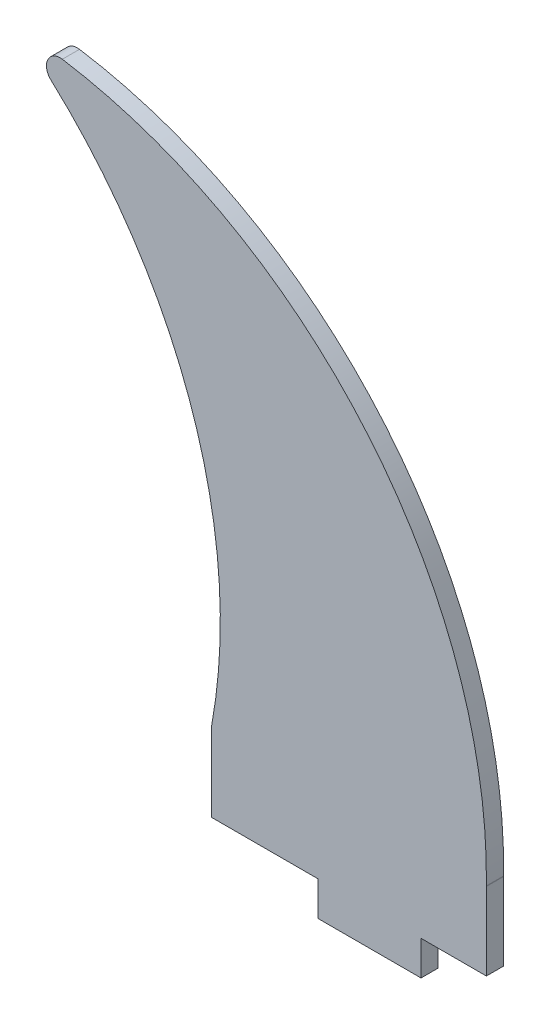
ISO-10303-21;
HEADER;
FILE_DESCRIPTION(('STEP AP214'),'2;1');
FILE_NAME('part.step','',(''),(''),'','','');
FILE_SCHEMA(('AUTOMOTIVE_DESIGN { 1 0 10303 214 1 1 1 1 }'));
ENDSEC;
DATA;
#1=APPLICATION_CONTEXT('core data for automotive mechanical design processes');
#2=APPLICATION_PROTOCOL_DEFINITION('international standard','automotive_design',2000,#1);
#3=PRODUCT_CONTEXT('',#1,'mechanical');
#4=PRODUCT('Part','Part','',(#3));
#5=PRODUCT_RELATED_PRODUCT_CATEGORY('part','',(#4));
#6=PRODUCT_DEFINITION_FORMATION('','',#4);
#7=PRODUCT_DEFINITION_CONTEXT('part definition',#1,'design');
#8=PRODUCT_DEFINITION('design','',#6,#7);
#9=PRODUCT_DEFINITION_SHAPE('','',#8);
#10=(LENGTH_UNIT() NAMED_UNIT(*) SI_UNIT(.MILLI.,.METRE.));
#11=(NAMED_UNIT(*) PLANE_ANGLE_UNIT() SI_UNIT($,.RADIAN.));
#12=(NAMED_UNIT(*) SI_UNIT($,.STERADIAN.) SOLID_ANGLE_UNIT());
#13=UNCERTAINTY_MEASURE_WITH_UNIT(LENGTH_MEASURE(1.E-05),#10,'distance_accuracy_value','');
#14=(GEOMETRIC_REPRESENTATION_CONTEXT(3) GLOBAL_UNCERTAINTY_ASSIGNED_CONTEXT((#13)) GLOBAL_UNIT_ASSIGNED_CONTEXT((#10,
#11,#12)) REPRESENTATION_CONTEXT('',''));
#15=CARTESIAN_POINT('',(0.,0.,0.));
#16=DIRECTION('',(0.,0.,1.));
#17=DIRECTION('',(1.,0.,0.));
#18=AXIS2_PLACEMENT_3D('',#15,#16,#17);
#19=CARTESIAN_POINT('',(-42.1158930006279,15.7352926467519,3.175));
#20=DIRECTION('',(0.,0.,-1.));
#21=DIRECTION('',(-1.,0.,0.));
#22=AXIS2_PLACEMENT_3D('',#19,#20,#21);
#23=CYLINDRICAL_SURFACE('',#22,92.948591990492);
#24=CARTESIAN_POINT('',(-42.1158930006279,15.7352926467519,0.));
#25=DIRECTION('',(0.,0.,1.));
#26=DIRECTION('',(1.,0.,0.));
#27=AXIS2_PLACEMENT_3D('',#24,#25,#26);
#28=CIRCLE('',#27,92.948591990492);
#29=CARTESIAN_POINT('',(-27.5289906449346,107.532150069435,0.));
#30=VERTEX_POINT('',#29);
#31=CARTESIAN_POINT('',(50.8234566403308,14.4245518903177,0.));
#32=VERTEX_POINT('',#31);
#33=EDGE_CURVE('E166',#30,#32,#28,.F.);
#34=ORIENTED_EDGE('',*,*,#33,.F.);
#35=DIRECTION('',(0.,0.,-1.));
#36=VECTOR('',#35,1.);
#37=CARTESIAN_POINT('',(-27.5289906449346,107.532150069435,3.175));
#38=LINE('',#37,#36);
#39=CARTESIAN_POINT('',(-27.5289906449346,107.532150069435,3.175));
#40=VERTEX_POINT('',#39);
#41=EDGE_CURVE('E43',#30,#40,#38,.F.);
#42=ORIENTED_EDGE('',*,*,#41,.T.);
#43=CARTESIAN_POINT('',(-42.1158930006279,15.7352926467519,3.175));
#44=DIRECTION('',(0.,0.,1.));
#45=DIRECTION('',(1.,0.,0.));
#46=AXIS2_PLACEMENT_3D('',#43,#44,#45);
#47=CIRCLE('',#46,92.948591990492);
#48=CARTESIAN_POINT('',(50.8234566403308,14.4245518903177,3.175));
#49=VERTEX_POINT('',#48);
#50=EDGE_CURVE('E152',#40,#49,#47,.F.);
#51=ORIENTED_EDGE('',*,*,#50,.T.);
#52=DIRECTION('',(0.,0.,-1.));
#53=VECTOR('',#52,1.);
#54=CARTESIAN_POINT('',(50.8234566403308,14.4245518903177,3.175));
#55=LINE('',#54,#53);
#56=EDGE_CURVE('E133',#49,#32,#55,.T.);
#57=ORIENTED_EDGE('',*,*,#56,.T.);
#58=EDGE_LOOP('',(#34,#42,#51,#57));
#59=FACE_BOUND('',#58,.T.);
#60=ADVANCED_FACE('F35',(#59),#23,.T.);
#61=CARTESIAN_POINT('',(-94.4551851220237,32.1733024197668,3.175));
#62=DIRECTION('',(0.,0.,-1.));
#63=DIRECTION('',(-1.,0.,0.));
#64=AXIS2_PLACEMENT_3D('',#61,#62,#63);
#65=CYLINDRICAL_SURFACE('',#64,96.1164142002075);
#66=CARTESIAN_POINT('',(-94.4551851220237,32.1733024197668,3.175));
#67=DIRECTION('',(0.,0.,1.));
#68=DIRECTION('',(1.,0.,0.));
#69=AXIS2_PLACEMENT_3D('',#66,#67,#68);
#70=CIRCLE('',#69,96.1164142002075);
#71=CARTESIAN_POINT('',(0.102948900171887,14.9360065487099,3.175));
#72=VERTEX_POINT('',#71);
#73=CARTESIAN_POINT('',(-29.6404195883238,103.148025015331,3.175));
#74=VERTEX_POINT('',#73);
#75=EDGE_CURVE('E149',#72,#74,#70,.T.);
#76=ORIENTED_EDGE('',*,*,#75,.T.);
#77=DIRECTION('',(0.,0.,-1.));
#78=VECTOR('',#77,1.);
#79=CARTESIAN_POINT('',(-29.6404195883238,103.148025015332,3.175));
#80=LINE('',#79,#78);
#81=CARTESIAN_POINT('',(-29.6404195883238,103.148025015331,0.));
#82=VERTEX_POINT('',#81);
#83=EDGE_CURVE('E211',#74,#82,#80,.T.);
#84=ORIENTED_EDGE('',*,*,#83,.T.);
#85=CARTESIAN_POINT('',(-94.4551851220237,32.1733024197668,0.));
#86=DIRECTION('',(0.,0.,1.));
#87=DIRECTION('',(1.,0.,0.));
#88=AXIS2_PLACEMENT_3D('',#85,#86,#87);
#89=CIRCLE('',#88,96.1164142002075);
#90=CARTESIAN_POINT('',(0.102948900171887,14.9360065487099,0.));
#91=VERTEX_POINT('',#90);
#92=EDGE_CURVE('E168',#91,#82,#89,.T.);
#93=ORIENTED_EDGE('',*,*,#92,.F.);
#94=DIRECTION('',(0.,0.,-1.));
#95=VECTOR('',#94,1.);
#96=CARTESIAN_POINT('',(0.102948900171887,14.9360065487099,3.175));
#97=LINE('',#96,#95);
#98=EDGE_CURVE('E203',#91,#72,#97,.F.);
#99=ORIENTED_EDGE('',*,*,#98,.T.);
#100=EDGE_LOOP('',(#76,#84,#93,#99));
#101=FACE_BOUND('',#100,.T.);
#102=ADVANCED_FACE('F217',(#101),#65,.F.);
#103=CARTESIAN_POINT('',(0.,0.,3.175));
#104=DIRECTION('',(-1.,0.,0.));
#105=DIRECTION('',(0.,0.,1.));
#106=AXIS2_PLACEMENT_3D('',#103,#104,#105);
#107=PLANE('',#106);
#108=DIRECTION('',(0.,1.,0.));
#109=VECTOR('',#108,1.);
#110=CARTESIAN_POINT('',(0.,0.,3.175));
#111=LINE('',#110,#109);
#112=CARTESIAN_POINT('',(0.,0.,3.175));
#113=VERTEX_POINT('',#112);
#114=CARTESIAN_POINT('',(0.,13.7972122054959,3.175));
#115=VERTEX_POINT('',#114);
#116=EDGE_CURVE('E127',#113,#115,#111,.T.);
#117=ORIENTED_EDGE('',*,*,#116,.T.);
#118=DIRECTION('',(0.,0.,-1.));
#119=VECTOR('',#118,1.);
#120=CARTESIAN_POINT('',(0.,13.7972122054959,3.175));
#121=LINE('',#120,#119);
#122=CARTESIAN_POINT('',(0.,13.7972122054959,0.));
#123=VERTEX_POINT('',#122);
#124=EDGE_CURVE('E199',#115,#123,#121,.T.);
#125=ORIENTED_EDGE('',*,*,#124,.T.);
#126=DIRECTION('',(0.,1.,0.));
#127=VECTOR('',#126,1.);
#128=CARTESIAN_POINT('',(0.,0.,0.));
#129=LINE('',#128,#127);
#130=CARTESIAN_POINT('',(0.,0.,0.));
#131=VERTEX_POINT('',#130);
#132=EDGE_CURVE('E130',#131,#123,#129,.T.);
#133=ORIENTED_EDGE('',*,*,#132,.F.);
#134=DIRECTION('',(0.,0.,-1.));
#135=VECTOR('',#134,1.);
#136=CARTESIAN_POINT('',(0.,0.,3.175));
#137=LINE('',#136,#135);
#138=EDGE_CURVE('E122',#113,#131,#137,.T.);
#139=ORIENTED_EDGE('',*,*,#138,.F.);
#140=EDGE_LOOP('',(#117,#125,#133,#139));
#141=FACE_BOUND('',#140,.T.);
#142=ADVANCED_FACE('F124',(#141),#107,.T.);
#143=CARTESIAN_POINT('',(0.,0.,3.175));
#144=DIRECTION('',(0.,1.,0.));
#145=DIRECTION('',(0.,0.,1.));
#146=AXIS2_PLACEMENT_3D('',#143,#144,#145);
#147=PLANE('',#146);
#148=DIRECTION('',(1.,0.,0.));
#149=VECTOR('',#148,1.);
#150=CARTESIAN_POINT('',(0.,0.,0.));
#151=LINE('',#150,#149);
#152=CARTESIAN_POINT('',(19.7016082065737,0.,0.));
#153=VERTEX_POINT('',#152);
#154=EDGE_CURVE('E171',#131,#153,#151,.T.);
#155=ORIENTED_EDGE('',*,*,#154,.T.);
#156=DIRECTION('',(0.,0.,-1.));
#157=VECTOR('',#156,1.);
#158=CARTESIAN_POINT('',(19.7016082065737,0.,3.175));
#159=LINE('',#158,#157);
#160=CARTESIAN_POINT('',(19.7016082065737,0.,3.175));
#161=VERTEX_POINT('',#160);
#162=EDGE_CURVE('E134',#161,#153,#159,.T.);
#163=ORIENTED_EDGE('',*,*,#162,.F.);
#164=DIRECTION('',(1.,0.,0.));
#165=VECTOR('',#164,1.);
#166=CARTESIAN_POINT('',(0.,0.,3.175));
#167=LINE('',#166,#165);
#168=EDGE_CURVE('E137',#113,#161,#167,.T.);
#169=ORIENTED_EDGE('',*,*,#168,.F.);
#170=ORIENTED_EDGE('',*,*,#138,.T.);
#171=EDGE_LOOP('',(#155,#163,#169,#170));
#172=FACE_BOUND('',#171,.T.);
#173=ADVANCED_FACE('F138',(#172),#147,.F.);
#174=CARTESIAN_POINT('',(19.7016082065737,0.,3.175));
#175=DIRECTION('',(1.,0.,0.));
#176=DIRECTION('',(0.,0.,-1.));
#177=AXIS2_PLACEMENT_3D('',#174,#175,#176);
#178=PLANE('',#177);
#179=DIRECTION('',(0.,-1.,0.));
#180=VECTOR('',#179,1.);
#181=CARTESIAN_POINT('',(19.7016082065737,0.,0.));
#182=LINE('',#181,#180);
#183=CARTESIAN_POINT('',(19.7016082065737,-6.35,0.));
#184=VERTEX_POINT('',#183);
#185=EDGE_CURVE('E173',#153,#184,#182,.T.);
#186=ORIENTED_EDGE('',*,*,#185,.T.);
#187=DIRECTION('',(0.,0.,-1.));
#188=VECTOR('',#187,1.);
#189=CARTESIAN_POINT('',(19.7016082065737,-6.35,3.175));
#190=LINE('',#189,#188);
#191=CARTESIAN_POINT('',(19.7016082065737,-6.35,3.175));
#192=VERTEX_POINT('',#191);
#193=EDGE_CURVE('E191',#192,#184,#190,.T.);
#194=ORIENTED_EDGE('',*,*,#193,.F.);
#195=DIRECTION('',(0.,-1.,0.));
#196=VECTOR('',#195,1.);
#197=CARTESIAN_POINT('',(19.7016082065737,0.,3.175));
#198=LINE('',#197,#196);
#199=EDGE_CURVE('E142',#161,#192,#198,.T.);
#200=ORIENTED_EDGE('',*,*,#199,.F.);
#201=ORIENTED_EDGE('',*,*,#162,.T.);
#202=EDGE_LOOP('',(#186,#194,#200,#201));
#203=FACE_BOUND('',#202,.T.);
#204=ADVANCED_FACE('F267',(#203),#178,.F.);
#205=CARTESIAN_POINT('',(0.,-6.35,3.175));
#206=DIRECTION('',(0.,1.,0.));
#207=DIRECTION('',(0.,0.,1.));
#208=AXIS2_PLACEMENT_3D('',#205,#206,#207);
#209=PLANE('',#208);
#210=DIRECTION('',(1.,0.,0.));
#211=VECTOR('',#210,1.);
#212=CARTESIAN_POINT('',(0.,-6.35,0.));
#213=LINE('',#212,#211);
#214=CARTESIAN_POINT('',(38.7516082065737,-6.35,0.));
#215=VERTEX_POINT('',#214);
#216=EDGE_CURVE('E176',#184,#215,#213,.T.);
#217=ORIENTED_EDGE('',*,*,#216,.T.);
#218=DIRECTION('',(0.,0.,-1.));
#219=VECTOR('',#218,1.);
#220=CARTESIAN_POINT('',(38.7516082065737,-6.35,3.175));
#221=LINE('',#220,#219);
#222=CARTESIAN_POINT('',(38.7516082065737,-6.35,3.175));
#223=VERTEX_POINT('',#222);
#224=EDGE_CURVE('E189',#223,#215,#221,.T.);
#225=ORIENTED_EDGE('',*,*,#224,.F.);
#226=DIRECTION('',(1.,0.,0.));
#227=VECTOR('',#226,1.);
#228=CARTESIAN_POINT('',(0.,-6.35,3.175));
#229=LINE('',#228,#227);
#230=EDGE_CURVE('E157',#192,#223,#229,.T.);
#231=ORIENTED_EDGE('',*,*,#230,.F.);
#232=ORIENTED_EDGE('',*,*,#193,.T.);
#233=EDGE_LOOP('',(#217,#225,#231,#232));
#234=FACE_BOUND('',#233,.T.);
#235=ADVANCED_FACE('F263',(#234),#209,.F.);
#236=CARTESIAN_POINT('',(38.7516082065737,0.,3.175));
#237=DIRECTION('',(1.,0.,0.));
#238=DIRECTION('',(0.,0.,-1.));
#239=AXIS2_PLACEMENT_3D('',#236,#237,#238);
#240=PLANE('',#239);
#241=DIRECTION('',(0.,-1.,0.));
#242=VECTOR('',#241,1.);
#243=CARTESIAN_POINT('',(38.7516082065737,0.,0.));
#244=LINE('',#243,#242);
#245=CARTESIAN_POINT('',(38.7516082065737,0.,0.));
#246=VERTEX_POINT('',#245);
#247=EDGE_CURVE('E179',#246,#215,#244,.T.);
#248=ORIENTED_EDGE('',*,*,#247,.F.);
#249=DIRECTION('',(0.,0.,-1.));
#250=VECTOR('',#249,1.);
#251=CARTESIAN_POINT('',(38.7516082065737,0.,3.175));
#252=LINE('',#251,#250);
#253=CARTESIAN_POINT('',(38.7516082065737,0.,3.175));
#254=VERTEX_POINT('',#253);
#255=EDGE_CURVE('E187',#254,#246,#252,.T.);
#256=ORIENTED_EDGE('',*,*,#255,.F.);
#257=DIRECTION('',(0.,-1.,0.));
#258=VECTOR('',#257,1.);
#259=CARTESIAN_POINT('',(38.7516082065737,0.,3.175));
#260=LINE('',#259,#258);
#261=EDGE_CURVE('E159',#254,#223,#260,.T.);
#262=ORIENTED_EDGE('',*,*,#261,.T.);
#263=ORIENTED_EDGE('',*,*,#224,.T.);
#264=EDGE_LOOP('',(#248,#256,#262,#263));
#265=FACE_BOUND('',#264,.T.);
#266=ADVANCED_FACE('F259',(#265),#240,.T.);
#267=CARTESIAN_POINT('',(50.8228252276512,0.,0.));
#268=VERTEX_POINT('',#267);
#269=EDGE_CURVE('E174',#246,#268,#151,.T.);
#270=ORIENTED_EDGE('',*,*,#269,.T.);
#271=DIRECTION('',(0.,0.,-1.));
#272=VECTOR('',#271,1.);
#273=CARTESIAN_POINT('',(50.8228252276512,0.,3.175));
#274=LINE('',#273,#272);
#275=CARTESIAN_POINT('',(50.8228252276512,0.,3.175));
#276=VERTEX_POINT('',#275);
#277=EDGE_CURVE('E165',#276,#268,#274,.T.);
#278=ORIENTED_EDGE('',*,*,#277,.F.);
#279=EDGE_CURVE('E144',#254,#276,#167,.T.);
#280=ORIENTED_EDGE('',*,*,#279,.F.);
#281=ORIENTED_EDGE('',*,*,#255,.T.);
#282=EDGE_LOOP('',(#270,#278,#280,#281));
#283=FACE_BOUND('',#282,.T.);
#284=ADVANCED_FACE('F276',(#283),#147,.F.);
#285=CARTESIAN_POINT('',(50.8228252276512,0.,3.175));
#286=DIRECTION('',(-1.,0.,0.));
#287=DIRECTION('',(0.,0.,1.));
#288=AXIS2_PLACEMENT_3D('',#285,#286,#287);
#289=PLANE('',#288);
#290=DIRECTION('',(0.,1.,0.));
#291=VECTOR('',#290,1.);
#292=CARTESIAN_POINT('',(50.8228252276512,0.,0.));
#293=LINE('',#292,#291);
#294=CARTESIAN_POINT('',(50.8228252276512,14.3350055763271,0.));
#295=VERTEX_POINT('',#294);
#296=EDGE_CURVE('E182',#268,#295,#293,.T.);
#297=ORIENTED_EDGE('',*,*,#296,.T.);
#298=DIRECTION('',(0.,0.,-1.));
#299=VECTOR('',#298,1.);
#300=CARTESIAN_POINT('',(50.8228252276512,14.3350055763271,3.175));
#301=LINE('',#300,#299);
#302=CARTESIAN_POINT('',(50.8228252276512,14.3350055763271,3.175));
#303=VERTEX_POINT('',#302);
#304=EDGE_CURVE('E197',#295,#303,#301,.F.);
#305=ORIENTED_EDGE('',*,*,#304,.T.);
#306=DIRECTION('',(0.,1.,0.));
#307=VECTOR('',#306,1.);
#308=CARTESIAN_POINT('',(50.8228252276512,0.,3.175));
#309=LINE('',#308,#307);
#310=EDGE_CURVE('E162',#276,#303,#309,.T.);
#311=ORIENTED_EDGE('',*,*,#310,.F.);
#312=ORIENTED_EDGE('',*,*,#277,.T.);
#313=EDGE_LOOP('',(#297,#305,#311,#312));
#314=FACE_BOUND('',#313,.T.);
#315=ADVANCED_FACE('F252',(#314),#289,.F.);
#316=CARTESIAN_POINT('',(0.,0.,3.175));
#317=DIRECTION('',(0.,0.,1.));
#318=DIRECTION('',(1.,0.,0.));
#319=AXIS2_PLACEMENT_3D('',#316,#317,#318);
#320=PLANE('',#319);
#321=ORIENTED_EDGE('',*,*,#50,.F.);
#322=CARTESIAN_POINT('',(-27.927605956797,105.023623443475,3.175));
#323=DIRECTION('',(0.,0.,1.));
#324=DIRECTION('',(1.,0.,0.));
#325=AXIS2_PLACEMENT_3D('',#322,#323,#324);
#326=CIRCLE('',#325,2.54);
#327=EDGE_CURVE('E11',#40,#74,#326,.T.);
#328=ORIENTED_EDGE('',*,*,#327,.T.);
#329=ORIENTED_EDGE('',*,*,#75,.F.);
#330=CARTESIAN_POINT('',(6.34999999999999,13.7972122054959,3.175));
#331=DIRECTION('',(0.,0.,1.));
#332=DIRECTION('',(1.,0.,0.));
#333=AXIS2_PLACEMENT_3D('',#330,#331,#332);
#334=CIRCLE('',#333,6.35);
#335=EDGE_CURVE('E148',#72,#115,#334,.T.);
#336=ORIENTED_EDGE('',*,*,#335,.T.);
#337=ORIENTED_EDGE('',*,*,#116,.F.);
#338=ORIENTED_EDGE('',*,*,#168,.T.);
#339=ORIENTED_EDGE('',*,*,#199,.T.);
#340=ORIENTED_EDGE('',*,*,#230,.T.);
#341=ORIENTED_EDGE('',*,*,#261,.F.);
#342=ORIENTED_EDGE('',*,*,#279,.T.);
#343=ORIENTED_EDGE('',*,*,#310,.T.);
#344=CARTESIAN_POINT('',(57.1728252276512,14.3350055763271,3.175));
#345=DIRECTION('',(0.,0.,1.));
#346=DIRECTION('',(1.,0.,0.));
#347=AXIS2_PLACEMENT_3D('',#344,#345,#346);
#348=CIRCLE('',#347,6.35);
#349=EDGE_CURVE('E208',#303,#49,#348,.F.);
#350=ORIENTED_EDGE('',*,*,#349,.T.);
#351=EDGE_LOOP('',(#321,#328,#329,#336,#337,#338,#339,#340,#341,#342,#343,#350));
#352=FACE_BOUND('',#351,.T.);
#353=ADVANCED_FACE('F145',(#352),#320,.T.);
#354=CARTESIAN_POINT('',(0.,0.,0.));
#355=DIRECTION('',(0.,0.,1.));
#356=DIRECTION('',(1.,0.,0.));
#357=AXIS2_PLACEMENT_3D('',#354,#355,#356);
#358=PLANE('',#357);
#359=ORIENTED_EDGE('',*,*,#92,.T.);
#360=CARTESIAN_POINT('',(-27.927605956797,105.023623443475,0.));
#361=DIRECTION('',(0.,0.,1.));
#362=DIRECTION('',(1.,0.,0.));
#363=AXIS2_PLACEMENT_3D('',#360,#361,#362);
#364=CIRCLE('',#363,2.54);
#365=EDGE_CURVE('E57',#82,#30,#364,.F.);
#366=ORIENTED_EDGE('',*,*,#365,.T.);
#367=ORIENTED_EDGE('',*,*,#33,.T.);
#368=CARTESIAN_POINT('',(57.1728252276512,14.3350055763271,0.));
#369=DIRECTION('',(0.,0.,1.));
#370=DIRECTION('',(1.,0.,0.));
#371=AXIS2_PLACEMENT_3D('',#368,#369,#370);
#372=CIRCLE('',#371,6.35);
#373=EDGE_CURVE('E206',#32,#295,#372,.T.);
#374=ORIENTED_EDGE('',*,*,#373,.T.);
#375=ORIENTED_EDGE('',*,*,#296,.F.);
#376=ORIENTED_EDGE('',*,*,#269,.F.);
#377=ORIENTED_EDGE('',*,*,#247,.T.);
#378=ORIENTED_EDGE('',*,*,#216,.F.);
#379=ORIENTED_EDGE('',*,*,#185,.F.);
#380=ORIENTED_EDGE('',*,*,#154,.F.);
#381=ORIENTED_EDGE('',*,*,#132,.T.);
#382=CARTESIAN_POINT('',(6.34999999999999,13.7972122054959,0.));
#383=DIRECTION('',(0.,0.,1.));
#384=DIRECTION('',(1.,0.,0.));
#385=AXIS2_PLACEMENT_3D('',#382,#383,#384);
#386=CIRCLE('',#385,6.35);
#387=EDGE_CURVE('E201',#123,#91,#386,.F.);
#388=ORIENTED_EDGE('',*,*,#387,.T.);
#389=EDGE_LOOP('',(#359,#366,#367,#374,#375,#376,#377,#378,#379,#380,#381,#388));
#390=FACE_BOUND('',#389,.T.);
#391=ADVANCED_FACE('F221',(#390),#358,.F.);
#392=CARTESIAN_POINT('',(57.1728252276512,14.3350055763271,3.175));
#393=DIRECTION('',(0.,0.,-1.));
#394=DIRECTION('',(-1.,0.,0.));
#395=AXIS2_PLACEMENT_3D('',#392,#393,#394);
#396=CYLINDRICAL_SURFACE('',#395,6.35);
#397=ORIENTED_EDGE('',*,*,#349,.F.);
#398=ORIENTED_EDGE('',*,*,#304,.F.);
#399=ORIENTED_EDGE('',*,*,#373,.F.);
#400=ORIENTED_EDGE('',*,*,#56,.F.);
#401=EDGE_LOOP('',(#397,#398,#399,#400));
#402=FACE_BOUND('',#401,.T.);
#403=ADVANCED_FACE('F228',(#402),#396,.F.);
#404=CARTESIAN_POINT('',(6.34999999999999,13.7972122054959,3.175));
#405=DIRECTION('',(0.,0.,-1.));
#406=DIRECTION('',(-1.,0.,0.));
#407=AXIS2_PLACEMENT_3D('',#404,#405,#406);
#408=CYLINDRICAL_SURFACE('',#407,6.35);
#409=ORIENTED_EDGE('',*,*,#335,.F.);
#410=ORIENTED_EDGE('',*,*,#98,.F.);
#411=ORIENTED_EDGE('',*,*,#387,.F.);
#412=ORIENTED_EDGE('',*,*,#124,.F.);
#413=EDGE_LOOP('',(#409,#410,#411,#412));
#414=FACE_BOUND('',#413,.T.);
#415=ADVANCED_FACE('F223',(#414),#408,.T.);
#416=CARTESIAN_POINT('',(-27.927605956797,105.023623443475,3.175));
#417=DIRECTION('',(0.,0.,1.));
#418=DIRECTION('',(1.,0.,0.));
#419=AXIS2_PLACEMENT_3D('',#416,#417,#418);
#420=CYLINDRICAL_SURFACE('',#419,2.54);
#421=ORIENTED_EDGE('',*,*,#327,.F.);
#422=ORIENTED_EDGE('',*,*,#41,.F.);
#423=ORIENTED_EDGE('',*,*,#365,.F.);
#424=ORIENTED_EDGE('',*,*,#83,.F.);
#425=EDGE_LOOP('',(#421,#422,#423,#424));
#426=FACE_BOUND('',#425,.T.);
#427=ADVANCED_FACE('F37',(#426),#420,.T.);
#428=CLOSED_SHELL('',(#60,#102,#142,#173,#204,#235,#266,#284,#315,#353,#391,#403,#415,#427));
#429=MANIFOLD_SOLID_BREP('B2',#428);
#430=ADVANCED_BREP_SHAPE_REPRESENTATION('',(#18,#429),#14);
#431=SHAPE_DEFINITION_REPRESENTATION(#9,#430);
ENDSEC;
END-ISO-10303-21;
